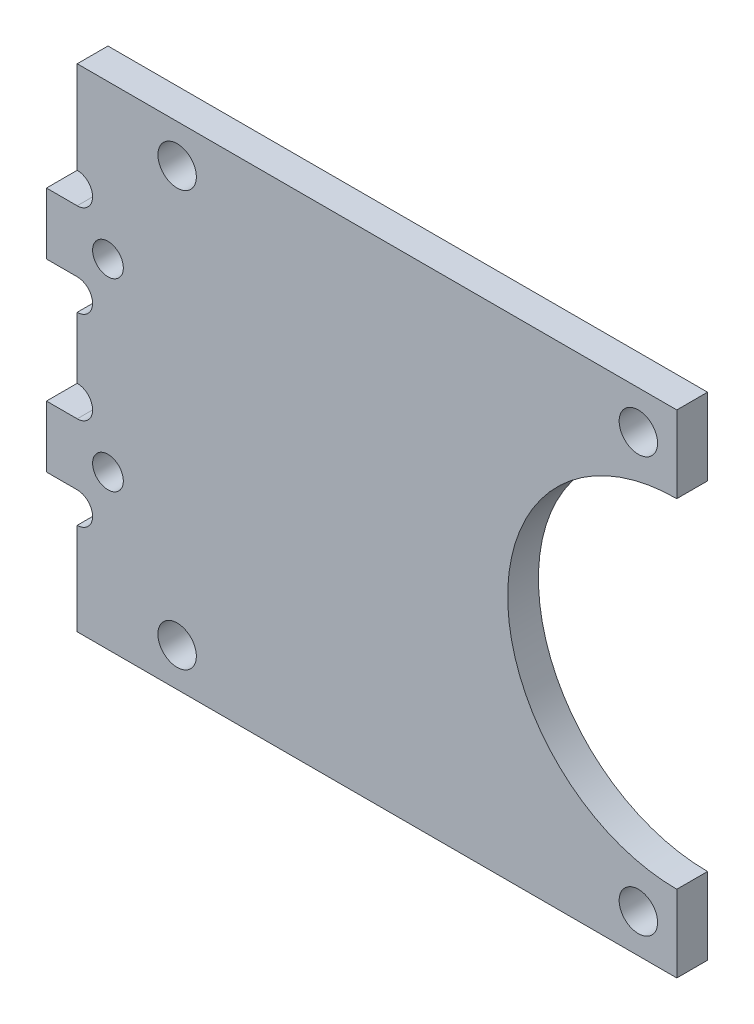
ISO-10303-21;
HEADER;
FILE_DESCRIPTION(('STEP AP214'),'2;1');
FILE_NAME('part.step','',(''),(''),'','','');
FILE_SCHEMA(('AUTOMOTIVE_DESIGN { 1 0 10303 214 1 1 1 1 }'));
ENDSEC;
DATA;
#1=APPLICATION_CONTEXT('core data for automotive mechanical design processes');
#2=APPLICATION_PROTOCOL_DEFINITION('international standard','automotive_design',2000,#1);
#3=PRODUCT_CONTEXT('',#1,'mechanical');
#4=PRODUCT('Part','Part','',(#3));
#5=PRODUCT_RELATED_PRODUCT_CATEGORY('part','',(#4));
#6=PRODUCT_DEFINITION_FORMATION('','',#4);
#7=PRODUCT_DEFINITION_CONTEXT('part definition',#1,'design');
#8=PRODUCT_DEFINITION('design','',#6,#7);
#9=PRODUCT_DEFINITION_SHAPE('','',#8);
#10=(LENGTH_UNIT() NAMED_UNIT(*) SI_UNIT(.MILLI.,.METRE.));
#11=(NAMED_UNIT(*) PLANE_ANGLE_UNIT() SI_UNIT($,.RADIAN.));
#12=(NAMED_UNIT(*) SI_UNIT($,.STERADIAN.) SOLID_ANGLE_UNIT());
#13=UNCERTAINTY_MEASURE_WITH_UNIT(LENGTH_MEASURE(1.E-05),#10,'distance_accuracy_value','');
#14=(GEOMETRIC_REPRESENTATION_CONTEXT(3) GLOBAL_UNCERTAINTY_ASSIGNED_CONTEXT((#13)) GLOBAL_UNIT_ASSIGNED_CONTEXT((#10,
#11,#12)) REPRESENTATION_CONTEXT('',''));
#15=CARTESIAN_POINT('',(0.,0.,0.));
#16=DIRECTION('',(0.,0.,1.));
#17=DIRECTION('',(1.,0.,0.));
#18=AXIS2_PLACEMENT_3D('',#15,#16,#17);
#19=CARTESIAN_POINT('',(13.2837868020581,10.1625,2.));
#20=DIRECTION('',(-1.,0.,0.));
#21=DIRECTION('',(0.,-1.,0.));
#22=AXIS2_PLACEMENT_3D('',#19,#20,#21);
#23=PLANE('',#22);
#24=DIRECTION('',(0.,1.,0.));
#25=VECTOR('',#24,1.);
#26=CARTESIAN_POINT('',(13.2837868020581,10.1625,2.));
#27=LINE('',#26,#25);
#28=CARTESIAN_POINT('',(13.2837868020581,5.1625,2.));
#29=VERTEX_POINT('',#28);
#30=CARTESIAN_POINT('',(13.2837868020581,10.1625,2.));
#31=VERTEX_POINT('',#30);
#32=EDGE_CURVE('E55',#29,#31,#27,.T.);
#33=ORIENTED_EDGE('',*,*,#32,.F.);
#34=DIRECTION('',(0.,0.,-1.));
#35=VECTOR('',#34,1.);
#36=CARTESIAN_POINT('',(13.2837868020581,5.1625,2.));
#37=LINE('',#36,#35);
#38=CARTESIAN_POINT('',(13.2837868020581,5.1625,0.));
#39=VERTEX_POINT('',#38);
#40=EDGE_CURVE('E320',#29,#39,#37,.T.);
#41=ORIENTED_EDGE('',*,*,#40,.T.);
#42=DIRECTION('',(0.,1.,0.));
#43=VECTOR('',#42,1.);
#44=CARTESIAN_POINT('',(13.2837868020581,10.1625,0.));
#45=LINE('',#44,#43);
#46=CARTESIAN_POINT('',(13.2837868020581,10.1625,0.));
#47=VERTEX_POINT('',#46);
#48=EDGE_CURVE('E114',#39,#47,#45,.T.);
#49=ORIENTED_EDGE('',*,*,#48,.T.);
#50=DIRECTION('',(0.,0.,-1.));
#51=VECTOR('',#50,1.);
#52=CARTESIAN_POINT('',(13.2837868020581,10.1625,2.));
#53=LINE('',#52,#51);
#54=EDGE_CURVE('E192',#31,#47,#53,.T.);
#55=ORIENTED_EDGE('',*,*,#54,.F.);
#56=EDGE_LOOP('',(#33,#41,#49,#55));
#57=FACE_BOUND('',#56,.T.);
#58=ADVANCED_FACE('F32',(#57),#23,.F.);
#59=CARTESIAN_POINT('',(-25.7162131979419,3.1625,2.));
#60=DIRECTION('',(0.,0.,1.));
#61=DIRECTION('',(1.,0.,0.));
#62=AXIS2_PLACEMENT_3D('',#59,#60,#61);
#63=PLANE('',#62);
#64=CARTESIAN_POINT('',(13.2837868020581,-5.8375,2.));
#65=DIRECTION('',(0.,0.,-1.));
#66=DIRECTION('',(1.,0.,0.));
#67=AXIS2_PLACEMENT_3D('',#64,#65,#66);
#68=CIRCLE('',#67,11.);
#69=CARTESIAN_POINT('',(13.2837868020581,-16.8375,2.));
#70=VERTEX_POINT('',#69);
#71=EDGE_CURVE('E47',#70,#29,#68,.T.);
#72=ORIENTED_EDGE('',*,*,#71,.T.);
#73=ORIENTED_EDGE('',*,*,#32,.T.);
#74=DIRECTION('',(-1.,0.,0.));
#75=VECTOR('',#74,1.);
#76=CARTESIAN_POINT('',(-17.2162131979419,10.1625,2.));
#77=LINE('',#76,#75);
#78=CARTESIAN_POINT('',(-25.7162131979419,10.1625,2.));
#79=VERTEX_POINT('',#78);
#80=EDGE_CURVE('E119',#31,#79,#77,.T.);
#81=ORIENTED_EDGE('',*,*,#80,.T.);
#82=DIRECTION('',(0.,-1.,0.));
#83=VECTOR('',#82,1.);
#84=CARTESIAN_POINT('',(-25.7162131979419,10.1625,2.));
#85=LINE('',#84,#83);
#86=CARTESIAN_POINT('',(-25.7162131979419,4.1625,2.));
#87=VERTEX_POINT('',#86);
#88=EDGE_CURVE('E368',#79,#87,#85,.T.);
#89=ORIENTED_EDGE('',*,*,#88,.T.);
#90=CARTESIAN_POINT('',(-25.7162131979419,3.1625,2.));
#91=DIRECTION('',(0.,0.,-1.));
#92=DIRECTION('',(1.,0.,0.));
#93=AXIS2_PLACEMENT_3D('',#90,#91,#92);
#94=CIRCLE('',#93,1.);
#95=CARTESIAN_POINT('',(-25.7162131979419,2.1625,2.));
#96=VERTEX_POINT('',#95);
#97=EDGE_CURVE('E265',#87,#96,#94,.T.);
#98=ORIENTED_EDGE('',*,*,#97,.T.);
#99=DIRECTION('',(-1.,0.,0.));
#100=VECTOR('',#99,1.);
#101=CARTESIAN_POINT('',(-25.7162131979419,2.1625,2.));
#102=LINE('',#101,#100);
#103=CARTESIAN_POINT('',(-27.7162131979419,2.1625,2.));
#104=VERTEX_POINT('',#103);
#105=EDGE_CURVE('E287',#96,#104,#102,.T.);
#106=ORIENTED_EDGE('',*,*,#105,.T.);
#107=DIRECTION('',(0.,-1.,0.));
#108=VECTOR('',#107,1.);
#109=CARTESIAN_POINT('',(-27.7162131979419,2.1625,2.));
#110=LINE('',#109,#108);
#111=CARTESIAN_POINT('',(-27.7162131979419,-1.8375,2.));
#112=VERTEX_POINT('',#111);
#113=EDGE_CURVE('E284',#104,#112,#110,.T.);
#114=ORIENTED_EDGE('',*,*,#113,.T.);
#115=DIRECTION('',(1.,0.,0.));
#116=VECTOR('',#115,1.);
#117=CARTESIAN_POINT('',(-27.7162131979419,-1.8375,2.));
#118=LINE('',#117,#116);
#119=CARTESIAN_POINT('',(-25.7162131979419,-1.8375,2.));
#120=VERTEX_POINT('',#119);
#121=EDGE_CURVE('E286',#112,#120,#118,.T.);
#122=ORIENTED_EDGE('',*,*,#121,.T.);
#123=CARTESIAN_POINT('',(-25.7162131979419,-2.8375,2.));
#124=DIRECTION('',(0.,0.,-1.));
#125=DIRECTION('',(-1.,0.,0.));
#126=AXIS2_PLACEMENT_3D('',#123,#124,#125);
#127=CIRCLE('',#126,1.);
#128=CARTESIAN_POINT('',(-25.7162131979419,-3.8375,2.));
#129=VERTEX_POINT('',#128);
#130=EDGE_CURVE('E289',#120,#129,#127,.T.);
#131=ORIENTED_EDGE('',*,*,#130,.T.);
#132=DIRECTION('',(0.,-1.,0.));
#133=VECTOR('',#132,1.);
#134=CARTESIAN_POINT('',(-25.7162131979419,-3.8375,2.));
#135=LINE('',#134,#133);
#136=CARTESIAN_POINT('',(-25.7162131979419,-7.8375,2.));
#137=VERTEX_POINT('',#136);
#138=EDGE_CURVE('E295',#129,#137,#135,.T.);
#139=ORIENTED_EDGE('',*,*,#138,.T.);
#140=CARTESIAN_POINT('',(-25.7162131979419,-8.8375,2.));
#141=DIRECTION('',(0.,0.,-1.));
#142=DIRECTION('',(1.,0.,0.));
#143=AXIS2_PLACEMENT_3D('',#140,#141,#142);
#144=CIRCLE('',#143,1.);
#145=CARTESIAN_POINT('',(-25.7162131979419,-9.8375,2.));
#146=VERTEX_POINT('',#145);
#147=EDGE_CURVE('E297',#137,#146,#144,.T.);
#148=ORIENTED_EDGE('',*,*,#147,.T.);
#149=DIRECTION('',(-1.,0.,0.));
#150=VECTOR('',#149,1.);
#151=CARTESIAN_POINT('',(-27.7162131979419,-9.8375,2.));
#152=LINE('',#151,#150);
#153=CARTESIAN_POINT('',(-27.7162131979419,-9.8375,2.));
#154=VERTEX_POINT('',#153);
#155=EDGE_CURVE('E299',#146,#154,#152,.T.);
#156=ORIENTED_EDGE('',*,*,#155,.T.);
#157=DIRECTION('',(0.,-1.,0.));
#158=VECTOR('',#157,1.);
#159=CARTESIAN_POINT('',(-27.7162131979419,-13.8375,2.));
#160=LINE('',#159,#158);
#161=CARTESIAN_POINT('',(-27.7162131979419,-13.8375,2.));
#162=VERTEX_POINT('',#161);
#163=EDGE_CURVE('E301',#154,#162,#160,.T.);
#164=ORIENTED_EDGE('',*,*,#163,.T.);
#165=DIRECTION('',(1.,0.,0.));
#166=VECTOR('',#165,1.);
#167=CARTESIAN_POINT('',(-25.7162131979419,-13.8375,2.));
#168=LINE('',#167,#166);
#169=CARTESIAN_POINT('',(-25.7162131979419,-13.8375,2.));
#170=VERTEX_POINT('',#169);
#171=EDGE_CURVE('E303',#162,#170,#168,.T.);
#172=ORIENTED_EDGE('',*,*,#171,.T.);
#173=CARTESIAN_POINT('',(-25.7162131979419,-14.8375,2.));
#174=DIRECTION('',(0.,0.,-1.));
#175=DIRECTION('',(-1.,0.,0.));
#176=AXIS2_PLACEMENT_3D('',#173,#174,#175);
#177=CIRCLE('',#176,0.999999999999999);
#178=CARTESIAN_POINT('',(-25.7162131979419,-15.8375,2.));
#179=VERTEX_POINT('',#178);
#180=EDGE_CURVE('E169',#170,#179,#177,.T.);
#181=ORIENTED_EDGE('',*,*,#180,.T.);
#182=DIRECTION('',(0.,-1.,0.));
#183=VECTOR('',#182,1.);
#184=CARTESIAN_POINT('',(-25.7162131979419,-15.8375,2.));
#185=LINE('',#184,#183);
#186=CARTESIAN_POINT('',(-25.7162131979419,-21.8375,2.));
#187=VERTEX_POINT('',#186);
#188=EDGE_CURVE('E160',#179,#187,#185,.T.);
#189=ORIENTED_EDGE('',*,*,#188,.T.);
#190=DIRECTION('',(1.,0.,0.));
#191=VECTOR('',#190,1.);
#192=CARTESIAN_POINT('',(-19.7162131979419,-21.8375,2.));
#193=LINE('',#192,#191);
#194=CARTESIAN_POINT('',(13.2837868020581,-21.8375,2.));
#195=VERTEX_POINT('',#194);
#196=EDGE_CURVE('E166',#187,#195,#193,.T.);
#197=ORIENTED_EDGE('',*,*,#196,.T.);
#198=EDGE_CURVE('E188',#195,#70,#27,.T.);
#199=ORIENTED_EDGE('',*,*,#198,.T.);
#200=EDGE_LOOP('',(#72,#73,#81,#89,#98,#106,#114,#122,#131,#139,#148,#156,#164,#172,#181,#189,
#197,#199));
#201=FACE_BOUND('',#200,.T.);
#202=CARTESIAN_POINT('',(-23.7162131979419,0.162500000000001,2.));
#203=DIRECTION('',(0.,0.,1.));
#204=DIRECTION('',(1.,0.,0.));
#205=AXIS2_PLACEMENT_3D('',#202,#203,#204);
#206=CIRCLE('',#205,1.);
#207=CARTESIAN_POINT('',(-22.7162131979419,0.162500000000001,2.));
#208=VERTEX_POINT('',#207);
#209=EDGE_CURVE('E339',#208,#208,#206,.T.);
#210=ORIENTED_EDGE('',*,*,#209,.F.);
#211=EDGE_LOOP('',(#210));
#212=FACE_BOUND('',#211,.T.);
#213=CARTESIAN_POINT('',(10.7837868020581,7.6625,2.));
#214=DIRECTION('',(0.,0.,1.));
#215=DIRECTION('',(1.,0.,0.));
#216=AXIS2_PLACEMENT_3D('',#213,#214,#215);
#217=CIRCLE('',#216,1.25);
#218=CARTESIAN_POINT('',(12.0337868020581,7.6625,2.));
#219=VERTEX_POINT('',#218);
#220=EDGE_CURVE('E351',#219,#219,#217,.T.);
#221=ORIENTED_EDGE('',*,*,#220,.F.);
#222=EDGE_LOOP('',(#221));
#223=FACE_BOUND('',#222,.T.);
#224=CARTESIAN_POINT('',(-19.2162131979419,7.6625,2.));
#225=DIRECTION('',(0.,0.,1.));
#226=DIRECTION('',(1.,0.,0.));
#227=AXIS2_PLACEMENT_3D('',#224,#225,#226);
#228=CIRCLE('',#227,1.25);
#229=CARTESIAN_POINT('',(-17.9662131979419,7.6625,2.));
#230=VERTEX_POINT('',#229);
#231=EDGE_CURVE('E196',#230,#230,#228,.T.);
#232=ORIENTED_EDGE('',*,*,#231,.F.);
#233=EDGE_LOOP('',(#232));
#234=FACE_BOUND('',#233,.T.);
#235=CARTESIAN_POINT('',(10.7837868020581,-19.3375,2.));
#236=DIRECTION('',(0.,0.,1.));
#237=DIRECTION('',(1.,0.,0.));
#238=AXIS2_PLACEMENT_3D('',#235,#236,#237);
#239=CIRCLE('',#238,1.25);
#240=CARTESIAN_POINT('',(12.0337868020581,-19.3375,2.));
#241=VERTEX_POINT('',#240);
#242=EDGE_CURVE('E357',#241,#241,#239,.T.);
#243=ORIENTED_EDGE('',*,*,#242,.F.);
#244=EDGE_LOOP('',(#243));
#245=FACE_BOUND('',#244,.T.);
#246=CARTESIAN_POINT('',(-19.2162131979419,-19.3375,2.));
#247=DIRECTION('',(0.,0.,1.));
#248=DIRECTION('',(1.,0.,0.));
#249=AXIS2_PLACEMENT_3D('',#246,#247,#248);
#250=CIRCLE('',#249,1.25);
#251=CARTESIAN_POINT('',(-17.9662131979419,-19.3375,2.));
#252=VERTEX_POINT('',#251);
#253=EDGE_CURVE('E345',#252,#252,#250,.T.);
#254=ORIENTED_EDGE('',*,*,#253,.F.);
#255=EDGE_LOOP('',(#254));
#256=FACE_BOUND('',#255,.T.);
#257=CARTESIAN_POINT('',(-23.7162131979419,-11.8375,2.));
#258=DIRECTION('',(0.,0.,1.));
#259=DIRECTION('',(1.,0.,0.));
#260=AXIS2_PLACEMENT_3D('',#257,#258,#259);
#261=CIRCLE('',#260,1.);
#262=CARTESIAN_POINT('',(-22.7162131979419,-11.8375,2.));
#263=VERTEX_POINT('',#262);
#264=EDGE_CURVE('E331',#263,#263,#261,.T.);
#265=ORIENTED_EDGE('',*,*,#264,.F.);
#266=EDGE_LOOP('',(#265));
#267=FACE_BOUND('',#266,.T.);
#268=ADVANCED_FACE('F162',(#201,#212,#223,#234,#245,#256,#267),#63,.T.);
#269=CARTESIAN_POINT('',(-25.7162131979419,3.1625,0.));
#270=DIRECTION('',(0.,0.,1.));
#271=DIRECTION('',(1.,0.,0.));
#272=AXIS2_PLACEMENT_3D('',#269,#270,#271);
#273=PLANE('',#272);
#274=ORIENTED_EDGE('',*,*,#48,.F.);
#275=CARTESIAN_POINT('',(13.2837868020581,-5.8375,0.));
#276=DIRECTION('',(0.,0.,-1.));
#277=DIRECTION('',(1.,0.,0.));
#278=AXIS2_PLACEMENT_3D('',#275,#276,#277);
#279=CIRCLE('',#278,11.);
#280=CARTESIAN_POINT('',(13.2837868020581,-16.8375,0.));
#281=VERTEX_POINT('',#280);
#282=EDGE_CURVE('E321',#281,#39,#279,.T.);
#283=ORIENTED_EDGE('',*,*,#282,.F.);
#284=CARTESIAN_POINT('',(13.2837868020581,-21.8375,0.));
#285=VERTEX_POINT('',#284);
#286=EDGE_CURVE('E221',#285,#281,#45,.T.);
#287=ORIENTED_EDGE('',*,*,#286,.F.);
#288=DIRECTION('',(1.,0.,0.));
#289=VECTOR('',#288,1.);
#290=CARTESIAN_POINT('',(13.2837868020581,-21.8375,0.));
#291=LINE('',#290,#289);
#292=CARTESIAN_POINT('',(-25.7162131979419,-21.8375,0.));
#293=VERTEX_POINT('',#292);
#294=EDGE_CURVE('E219',#293,#285,#291,.T.);
#295=ORIENTED_EDGE('',*,*,#294,.F.);
#296=DIRECTION('',(0.,-1.,0.));
#297=VECTOR('',#296,1.);
#298=CARTESIAN_POINT('',(-25.7162131979419,-15.8375,0.));
#299=LINE('',#298,#297);
#300=CARTESIAN_POINT('',(-25.7162131979419,-15.8375,0.));
#301=VERTEX_POINT('',#300);
#302=EDGE_CURVE('E179',#301,#293,#299,.T.);
#303=ORIENTED_EDGE('',*,*,#302,.F.);
#304=CARTESIAN_POINT('',(-25.7162131979419,-14.8375,0.));
#305=DIRECTION('',(0.,0.,-1.));
#306=DIRECTION('',(-1.,0.,0.));
#307=AXIS2_PLACEMENT_3D('',#304,#305,#306);
#308=CIRCLE('',#307,0.999999999999999);
#309=CARTESIAN_POINT('',(-25.7162131979419,-13.8375,0.));
#310=VERTEX_POINT('',#309);
#311=EDGE_CURVE('E216',#310,#301,#308,.T.);
#312=ORIENTED_EDGE('',*,*,#311,.F.);
#313=DIRECTION('',(1.,0.,0.));
#314=VECTOR('',#313,1.);
#315=CARTESIAN_POINT('',(-25.7162131979419,-13.8375,0.));
#316=LINE('',#315,#314);
#317=CARTESIAN_POINT('',(-27.7162131979419,-13.8375,0.));
#318=VERTEX_POINT('',#317);
#319=EDGE_CURVE('E214',#318,#310,#316,.T.);
#320=ORIENTED_EDGE('',*,*,#319,.F.);
#321=DIRECTION('',(0.,-1.,0.));
#322=VECTOR('',#321,1.);
#323=CARTESIAN_POINT('',(-27.7162131979419,-13.8375,0.));
#324=LINE('',#323,#322);
#325=CARTESIAN_POINT('',(-27.7162131979419,-9.8375,0.));
#326=VERTEX_POINT('',#325);
#327=EDGE_CURVE('E212',#326,#318,#324,.T.);
#328=ORIENTED_EDGE('',*,*,#327,.F.);
#329=DIRECTION('',(-1.,0.,0.));
#330=VECTOR('',#329,1.);
#331=CARTESIAN_POINT('',(-27.7162131979419,-9.8375,0.));
#332=LINE('',#331,#330);
#333=CARTESIAN_POINT('',(-25.7162131979419,-9.8375,0.));
#334=VERTEX_POINT('',#333);
#335=EDGE_CURVE('E210',#334,#326,#332,.T.);
#336=ORIENTED_EDGE('',*,*,#335,.F.);
#337=CARTESIAN_POINT('',(-25.7162131979419,-8.8375,0.));
#338=DIRECTION('',(0.,0.,-1.));
#339=DIRECTION('',(1.,0.,0.));
#340=AXIS2_PLACEMENT_3D('',#337,#338,#339);
#341=CIRCLE('',#340,1.);
#342=CARTESIAN_POINT('',(-25.7162131979419,-7.8375,0.));
#343=VERTEX_POINT('',#342);
#344=EDGE_CURVE('E208',#343,#334,#341,.T.);
#345=ORIENTED_EDGE('',*,*,#344,.F.);
#346=DIRECTION('',(0.,-1.,0.));
#347=VECTOR('',#346,1.);
#348=CARTESIAN_POINT('',(-25.7162131979419,-3.8375,0.));
#349=LINE('',#348,#347);
#350=CARTESIAN_POINT('',(-25.7162131979419,-3.8375,0.));
#351=VERTEX_POINT('',#350);
#352=EDGE_CURVE('E206',#351,#343,#349,.T.);
#353=ORIENTED_EDGE('',*,*,#352,.F.);
#354=CARTESIAN_POINT('',(-25.7162131979419,-2.8375,0.));
#355=DIRECTION('',(0.,0.,-1.));
#356=DIRECTION('',(-1.,0.,0.));
#357=AXIS2_PLACEMENT_3D('',#354,#355,#356);
#358=CIRCLE('',#357,1.);
#359=CARTESIAN_POINT('',(-25.7162131979419,-1.8375,0.));
#360=VERTEX_POINT('',#359);
#361=EDGE_CURVE('E204',#360,#351,#358,.T.);
#362=ORIENTED_EDGE('',*,*,#361,.F.);
#363=DIRECTION('',(1.,0.,0.));
#364=VECTOR('',#363,1.);
#365=CARTESIAN_POINT('',(-27.7162131979419,-1.8375,0.));
#366=LINE('',#365,#364);
#367=CARTESIAN_POINT('',(-27.7162131979419,-1.8375,0.));
#368=VERTEX_POINT('',#367);
#369=EDGE_CURVE('E202',#368,#360,#366,.T.);
#370=ORIENTED_EDGE('',*,*,#369,.F.);
#371=DIRECTION('',(0.,-1.,0.));
#372=VECTOR('',#371,1.);
#373=CARTESIAN_POINT('',(-27.7162131979419,2.1625,0.));
#374=LINE('',#373,#372);
#375=CARTESIAN_POINT('',(-27.7162131979419,2.1625,0.));
#376=VERTEX_POINT('',#375);
#377=EDGE_CURVE('E200',#376,#368,#374,.T.);
#378=ORIENTED_EDGE('',*,*,#377,.F.);
#379=DIRECTION('',(-1.,0.,0.));
#380=VECTOR('',#379,1.);
#381=CARTESIAN_POINT('',(-25.7162131979419,2.1625,0.));
#382=LINE('',#381,#380);
#383=CARTESIAN_POINT('',(-25.7162131979419,2.1625,0.));
#384=VERTEX_POINT('',#383);
#385=EDGE_CURVE('E198',#384,#376,#382,.T.);
#386=ORIENTED_EDGE('',*,*,#385,.F.);
#387=CARTESIAN_POINT('',(-25.7162131979419,3.1625,0.));
#388=DIRECTION('',(0.,0.,-1.));
#389=DIRECTION('',(1.,0.,0.));
#390=AXIS2_PLACEMENT_3D('',#387,#388,#389);
#391=CIRCLE('',#390,1.);
#392=CARTESIAN_POINT('',(-25.7162131979419,4.1625,0.));
#393=VERTEX_POINT('',#392);
#394=EDGE_CURVE('E195',#393,#384,#391,.T.);
#395=ORIENTED_EDGE('',*,*,#394,.F.);
#396=DIRECTION('',(0.,-1.,0.));
#397=VECTOR('',#396,1.);
#398=CARTESIAN_POINT('',(-25.7162131979419,10.1625,0.));
#399=LINE('',#398,#397);
#400=CARTESIAN_POINT('',(-25.7162131979419,10.1625,0.));
#401=VERTEX_POINT('',#400);
#402=EDGE_CURVE('E193',#401,#393,#399,.T.);
#403=ORIENTED_EDGE('',*,*,#402,.F.);
#404=DIRECTION('',(-1.,0.,0.));
#405=VECTOR('',#404,1.);
#406=CARTESIAN_POINT('',(-17.2162131979419,10.1625,0.));
#407=LINE('',#406,#405);
#408=EDGE_CURVE('E224',#47,#401,#407,.T.);
#409=ORIENTED_EDGE('',*,*,#408,.F.);
#410=EDGE_LOOP('',(#274,#283,#287,#295,#303,#312,#320,#328,#336,#345,#353,#362,#370,#378,#386,
#395,#403,#409));
#411=FACE_BOUND('',#410,.T.);
#412=CARTESIAN_POINT('',(-19.2162131979419,7.6625,0.));
#413=DIRECTION('',(0.,0.,1.));
#414=DIRECTION('',(1.,0.,0.));
#415=AXIS2_PLACEMENT_3D('',#412,#413,#414);
#416=CIRCLE('',#415,1.25);
#417=CARTESIAN_POINT('',(-17.9662131979419,7.6625,0.));
#418=VERTEX_POINT('',#417);
#419=EDGE_CURVE('E360',#418,#418,#416,.T.);
#420=ORIENTED_EDGE('',*,*,#419,.T.);
#421=EDGE_LOOP('',(#420));
#422=FACE_BOUND('',#421,.T.);
#423=CARTESIAN_POINT('',(10.7837868020581,-19.3375,0.));
#424=DIRECTION('',(0.,0.,1.));
#425=DIRECTION('',(1.,0.,0.));
#426=AXIS2_PLACEMENT_3D('',#423,#424,#425);
#427=CIRCLE('',#426,1.25);
#428=CARTESIAN_POINT('',(12.0337868020581,-19.3375,0.));
#429=VERTEX_POINT('',#428);
#430=EDGE_CURVE('E354',#429,#429,#427,.T.);
#431=ORIENTED_EDGE('',*,*,#430,.T.);
#432=EDGE_LOOP('',(#431));
#433=FACE_BOUND('',#432,.T.);
#434=CARTESIAN_POINT('',(10.7837868020581,7.6625,0.));
#435=DIRECTION('',(0.,0.,1.));
#436=DIRECTION('',(1.,0.,0.));
#437=AXIS2_PLACEMENT_3D('',#434,#435,#436);
#438=CIRCLE('',#437,1.25);
#439=CARTESIAN_POINT('',(12.0337868020581,7.6625,0.));
#440=VERTEX_POINT('',#439);
#441=EDGE_CURVE('E348',#440,#440,#438,.T.);
#442=ORIENTED_EDGE('',*,*,#441,.T.);
#443=EDGE_LOOP('',(#442));
#444=FACE_BOUND('',#443,.T.);
#445=CARTESIAN_POINT('',(-19.2162131979419,-19.3375,0.));
#446=DIRECTION('',(0.,0.,1.));
#447=DIRECTION('',(1.,0.,0.));
#448=AXIS2_PLACEMENT_3D('',#445,#446,#447);
#449=CIRCLE('',#448,1.25);
#450=CARTESIAN_POINT('',(-17.9662131979419,-19.3375,0.));
#451=VERTEX_POINT('',#450);
#452=EDGE_CURVE('E342',#451,#451,#449,.T.);
#453=ORIENTED_EDGE('',*,*,#452,.T.);
#454=EDGE_LOOP('',(#453));
#455=FACE_BOUND('',#454,.T.);
#456=CARTESIAN_POINT('',(-23.7162131979419,0.162500000000001,0.));
#457=DIRECTION('',(0.,0.,1.));
#458=DIRECTION('',(1.,0.,0.));
#459=AXIS2_PLACEMENT_3D('',#456,#457,#458);
#460=CIRCLE('',#459,1.);
#461=CARTESIAN_POINT('',(-22.7162131979419,0.162500000000001,0.));
#462=VERTEX_POINT('',#461);
#463=EDGE_CURVE('E337',#462,#462,#460,.T.);
#464=ORIENTED_EDGE('',*,*,#463,.T.);
#465=EDGE_LOOP('',(#464));
#466=FACE_BOUND('',#465,.T.);
#467=CARTESIAN_POINT('',(-23.7162131979419,-11.8375,0.));
#468=DIRECTION('',(0.,0.,1.));
#469=DIRECTION('',(1.,0.,0.));
#470=AXIS2_PLACEMENT_3D('',#467,#468,#469);
#471=CIRCLE('',#470,1.);
#472=CARTESIAN_POINT('',(-22.7162131979419,-11.8375,0.));
#473=VERTEX_POINT('',#472);
#474=EDGE_CURVE('E328',#473,#473,#471,.T.);
#475=ORIENTED_EDGE('',*,*,#474,.T.);
#476=EDGE_LOOP('',(#475));
#477=FACE_BOUND('',#476,.T.);
#478=ADVANCED_FACE('F271',(#411,#422,#433,#444,#455,#466,#477),#273,.F.);
#479=CARTESIAN_POINT('',(-25.7162131979419,10.1625,2.));
#480=DIRECTION('',(1.,0.,0.));
#481=DIRECTION('',(0.,0.,-1.));
#482=AXIS2_PLACEMENT_3D('',#479,#480,#481);
#483=PLANE('',#482);
#484=ORIENTED_EDGE('',*,*,#402,.T.);
#485=DIRECTION('',(0.,0.,-1.));
#486=VECTOR('',#485,1.);
#487=CARTESIAN_POINT('',(-25.7162131979419,4.1625,2.));
#488=LINE('',#487,#486);
#489=EDGE_CURVE('E40',#87,#393,#488,.T.);
#490=ORIENTED_EDGE('',*,*,#489,.F.);
#491=ORIENTED_EDGE('',*,*,#88,.F.);
#492=DIRECTION('',(0.,0.,-1.));
#493=VECTOR('',#492,1.);
#494=CARTESIAN_POINT('',(-25.7162131979419,10.1625,2.));
#495=LINE('',#494,#493);
#496=EDGE_CURVE('E11',#79,#401,#495,.T.);
#497=ORIENTED_EDGE('',*,*,#496,.T.);
#498=EDGE_LOOP('',(#484,#490,#491,#497));
#499=FACE_BOUND('',#498,.T.);
#500=ADVANCED_FACE('F34',(#499),#483,.F.);
#501=CARTESIAN_POINT('',(-25.7162131979419,3.1625,2.));
#502=DIRECTION('',(0.,0.,-1.));
#503=DIRECTION('',(-1.,0.,0.));
#504=AXIS2_PLACEMENT_3D('',#501,#502,#503);
#505=CYLINDRICAL_SURFACE('',#504,1.);
#506=ORIENTED_EDGE('',*,*,#394,.T.);
#507=DIRECTION('',(0.,0.,-1.));
#508=VECTOR('',#507,1.);
#509=CARTESIAN_POINT('',(-25.7162131979419,2.1625,2.));
#510=LINE('',#509,#508);
#511=EDGE_CURVE('E256',#96,#384,#510,.T.);
#512=ORIENTED_EDGE('',*,*,#511,.F.);
#513=ORIENTED_EDGE('',*,*,#97,.F.);
#514=ORIENTED_EDGE('',*,*,#489,.T.);
#515=EDGE_LOOP('',(#506,#512,#513,#514));
#516=FACE_BOUND('',#515,.T.);
#517=ADVANCED_FACE('F263',(#516),#505,.F.);
#518=CARTESIAN_POINT('',(-25.7162131979419,2.1625,2.));
#519=DIRECTION('',(0.,-1.,0.));
#520=DIRECTION('',(1.,0.,0.));
#521=AXIS2_PLACEMENT_3D('',#518,#519,#520);
#522=PLANE('',#521);
#523=ORIENTED_EDGE('',*,*,#385,.T.);
#524=DIRECTION('',(0.,0.,-1.));
#525=VECTOR('',#524,1.);
#526=CARTESIAN_POINT('',(-27.7162131979419,2.1625,2.));
#527=LINE('',#526,#525);
#528=EDGE_CURVE('E253',#104,#376,#527,.T.);
#529=ORIENTED_EDGE('',*,*,#528,.F.);
#530=ORIENTED_EDGE('',*,*,#105,.F.);
#531=ORIENTED_EDGE('',*,*,#511,.T.);
#532=EDGE_LOOP('',(#523,#529,#530,#531));
#533=FACE_BOUND('',#532,.T.);
#534=ADVANCED_FACE('F278',(#533),#522,.F.);
#535=CARTESIAN_POINT('',(-27.7162131979419,2.1625,2.));
#536=DIRECTION('',(1.,0.,0.));
#537=DIRECTION('',(0.,0.,-1.));
#538=AXIS2_PLACEMENT_3D('',#535,#536,#537);
#539=PLANE('',#538);
#540=ORIENTED_EDGE('',*,*,#377,.T.);
#541=DIRECTION('',(0.,0.,-1.));
#542=VECTOR('',#541,1.);
#543=CARTESIAN_POINT('',(-27.7162131979419,-1.8375,2.));
#544=LINE('',#543,#542);
#545=EDGE_CURVE('E250',#112,#368,#544,.T.);
#546=ORIENTED_EDGE('',*,*,#545,.F.);
#547=ORIENTED_EDGE('',*,*,#113,.F.);
#548=ORIENTED_EDGE('',*,*,#528,.T.);
#549=EDGE_LOOP('',(#540,#546,#547,#548));
#550=FACE_BOUND('',#549,.T.);
#551=ADVANCED_FACE('F282',(#550),#539,.F.);
#552=CARTESIAN_POINT('',(-27.7162131979419,-1.8375,2.));
#553=DIRECTION('',(0.,1.,0.));
#554=DIRECTION('',(-1.,0.,0.));
#555=AXIS2_PLACEMENT_3D('',#552,#553,#554);
#556=PLANE('',#555);
#557=ORIENTED_EDGE('',*,*,#369,.T.);
#558=DIRECTION('',(0.,0.,-1.));
#559=VECTOR('',#558,1.);
#560=CARTESIAN_POINT('',(-25.7162131979419,-1.8375,2.));
#561=LINE('',#560,#559);
#562=EDGE_CURVE('E247',#120,#360,#561,.T.);
#563=ORIENTED_EDGE('',*,*,#562,.F.);
#564=ORIENTED_EDGE('',*,*,#121,.F.);
#565=ORIENTED_EDGE('',*,*,#545,.T.);
#566=EDGE_LOOP('',(#557,#563,#564,#565));
#567=FACE_BOUND('',#566,.T.);
#568=ADVANCED_FACE('F417',(#567),#556,.F.);
#569=CARTESIAN_POINT('',(-25.7162131979419,-2.8375,2.));
#570=DIRECTION('',(0.,0.,-1.));
#571=DIRECTION('',(-1.,0.,0.));
#572=AXIS2_PLACEMENT_3D('',#569,#570,#571);
#573=CYLINDRICAL_SURFACE('',#572,1.);
#574=ORIENTED_EDGE('',*,*,#361,.T.);
#575=DIRECTION('',(0.,0.,-1.));
#576=VECTOR('',#575,1.);
#577=CARTESIAN_POINT('',(-25.7162131979419,-3.8375,2.));
#578=LINE('',#577,#576);
#579=EDGE_CURVE('E244',#129,#351,#578,.T.);
#580=ORIENTED_EDGE('',*,*,#579,.F.);
#581=ORIENTED_EDGE('',*,*,#130,.F.);
#582=ORIENTED_EDGE('',*,*,#562,.T.);
#583=EDGE_LOOP('',(#574,#580,#581,#582));
#584=FACE_BOUND('',#583,.T.);
#585=ADVANCED_FACE('F413',(#584),#573,.F.);
#586=CARTESIAN_POINT('',(-25.7162131979419,-3.8375,2.));
#587=DIRECTION('',(1.,0.,0.));
#588=DIRECTION('',(0.,0.,-1.));
#589=AXIS2_PLACEMENT_3D('',#586,#587,#588);
#590=PLANE('',#589);
#591=ORIENTED_EDGE('',*,*,#352,.T.);
#592=DIRECTION('',(0.,0.,-1.));
#593=VECTOR('',#592,1.);
#594=CARTESIAN_POINT('',(-25.7162131979419,-7.8375,2.));
#595=LINE('',#594,#593);
#596=EDGE_CURVE('E241',#137,#343,#595,.T.);
#597=ORIENTED_EDGE('',*,*,#596,.F.);
#598=ORIENTED_EDGE('',*,*,#138,.F.);
#599=ORIENTED_EDGE('',*,*,#579,.T.);
#600=EDGE_LOOP('',(#591,#597,#598,#599));
#601=FACE_BOUND('',#600,.T.);
#602=ADVANCED_FACE('F409',(#601),#590,.F.);
#603=CARTESIAN_POINT('',(-25.7162131979419,-8.8375,2.));
#604=DIRECTION('',(0.,0.,-1.));
#605=DIRECTION('',(-1.,0.,0.));
#606=AXIS2_PLACEMENT_3D('',#603,#604,#605);
#607=CYLINDRICAL_SURFACE('',#606,1.);
#608=ORIENTED_EDGE('',*,*,#344,.T.);
#609=DIRECTION('',(0.,0.,-1.));
#610=VECTOR('',#609,1.);
#611=CARTESIAN_POINT('',(-25.7162131979419,-9.8375,2.));
#612=LINE('',#611,#610);
#613=EDGE_CURVE('E238',#146,#334,#612,.T.);
#614=ORIENTED_EDGE('',*,*,#613,.F.);
#615=ORIENTED_EDGE('',*,*,#147,.F.);
#616=ORIENTED_EDGE('',*,*,#596,.T.);
#617=EDGE_LOOP('',(#608,#614,#615,#616));
#618=FACE_BOUND('',#617,.T.);
#619=ADVANCED_FACE('F405',(#618),#607,.F.);
#620=CARTESIAN_POINT('',(-27.7162131979419,-9.8375,2.));
#621=DIRECTION('',(0.,-1.,0.));
#622=DIRECTION('',(0.,0.,-1.));
#623=AXIS2_PLACEMENT_3D('',#620,#621,#622);
#624=PLANE('',#623);
#625=ORIENTED_EDGE('',*,*,#335,.T.);
#626=DIRECTION('',(0.,0.,-1.));
#627=VECTOR('',#626,1.);
#628=CARTESIAN_POINT('',(-27.7162131979419,-9.8375,2.));
#629=LINE('',#628,#627);
#630=EDGE_CURVE('E235',#154,#326,#629,.T.);
#631=ORIENTED_EDGE('',*,*,#630,.F.);
#632=ORIENTED_EDGE('',*,*,#155,.F.);
#633=ORIENTED_EDGE('',*,*,#613,.T.);
#634=EDGE_LOOP('',(#625,#631,#632,#633));
#635=FACE_BOUND('',#634,.T.);
#636=ADVANCED_FACE('F401',(#635),#624,.F.);
#637=CARTESIAN_POINT('',(-27.7162131979419,-13.8375,2.));
#638=DIRECTION('',(1.,0.,0.));
#639=DIRECTION('',(0.,0.,-1.));
#640=AXIS2_PLACEMENT_3D('',#637,#638,#639);
#641=PLANE('',#640);
#642=ORIENTED_EDGE('',*,*,#327,.T.);
#643=DIRECTION('',(0.,0.,-1.));
#644=VECTOR('',#643,1.);
#645=CARTESIAN_POINT('',(-27.7162131979419,-13.8375,2.));
#646=LINE('',#645,#644);
#647=EDGE_CURVE('E232',#162,#318,#646,.T.);
#648=ORIENTED_EDGE('',*,*,#647,.F.);
#649=ORIENTED_EDGE('',*,*,#163,.F.);
#650=ORIENTED_EDGE('',*,*,#630,.T.);
#651=EDGE_LOOP('',(#642,#648,#649,#650));
#652=FACE_BOUND('',#651,.T.);
#653=ADVANCED_FACE('F398',(#652),#641,.F.);
#654=CARTESIAN_POINT('',(-25.7162131979419,-13.8375,2.));
#655=DIRECTION('',(0.,1.,0.));
#656=DIRECTION('',(-1.,0.,0.));
#657=AXIS2_PLACEMENT_3D('',#654,#655,#656);
#658=PLANE('',#657);
#659=ORIENTED_EDGE('',*,*,#319,.T.);
#660=DIRECTION('',(0.,0.,-1.));
#661=VECTOR('',#660,1.);
#662=CARTESIAN_POINT('',(-25.7162131979419,-13.8375,2.));
#663=LINE('',#662,#661);
#664=EDGE_CURVE('E229',#170,#310,#663,.T.);
#665=ORIENTED_EDGE('',*,*,#664,.F.);
#666=ORIENTED_EDGE('',*,*,#171,.F.);
#667=ORIENTED_EDGE('',*,*,#647,.T.);
#668=EDGE_LOOP('',(#659,#665,#666,#667));
#669=FACE_BOUND('',#668,.T.);
#670=ADVANCED_FACE('F309',(#669),#658,.F.);
#671=CARTESIAN_POINT('',(-25.7162131979419,-14.8375,2.));
#672=DIRECTION('',(0.,0.,-1.));
#673=DIRECTION('',(-1.,0.,0.));
#674=AXIS2_PLACEMENT_3D('',#671,#672,#673);
#675=CYLINDRICAL_SURFACE('',#674,0.999999999999999);
#676=ORIENTED_EDGE('',*,*,#311,.T.);
#677=DIRECTION('',(0.,0.,-1.));
#678=VECTOR('',#677,1.);
#679=CARTESIAN_POINT('',(-25.7162131979419,-15.8375,2.));
#680=LINE('',#679,#678);
#681=EDGE_CURVE('E181',#179,#301,#680,.T.);
#682=ORIENTED_EDGE('',*,*,#681,.F.);
#683=ORIENTED_EDGE('',*,*,#180,.F.);
#684=ORIENTED_EDGE('',*,*,#664,.T.);
#685=EDGE_LOOP('',(#676,#682,#683,#684));
#686=FACE_BOUND('',#685,.T.);
#687=ADVANCED_FACE('F313',(#686),#675,.F.);
#688=CARTESIAN_POINT('',(-25.7162131979419,-15.8375,2.));
#689=DIRECTION('',(1.,0.,0.));
#690=DIRECTION('',(0.,1.,0.));
#691=AXIS2_PLACEMENT_3D('',#688,#689,#690);
#692=PLANE('',#691);
#693=ORIENTED_EDGE('',*,*,#302,.T.);
#694=DIRECTION('',(0.,0.,-1.));
#695=VECTOR('',#694,1.);
#696=CARTESIAN_POINT('',(-25.7162131979419,-21.8375,2.));
#697=LINE('',#696,#695);
#698=EDGE_CURVE('E176',#187,#293,#697,.T.);
#699=ORIENTED_EDGE('',*,*,#698,.F.);
#700=ORIENTED_EDGE('',*,*,#188,.F.);
#701=ORIENTED_EDGE('',*,*,#681,.T.);
#702=EDGE_LOOP('',(#693,#699,#700,#701));
#703=FACE_BOUND('',#702,.T.);
#704=ADVANCED_FACE('F177',(#703),#692,.F.);
#705=CARTESIAN_POINT('',(13.2837868020581,-21.8375,2.));
#706=DIRECTION('',(0.,1.,0.));
#707=DIRECTION('',(-1.,0.,0.));
#708=AXIS2_PLACEMENT_3D('',#705,#706,#707);
#709=PLANE('',#708);
#710=ORIENTED_EDGE('',*,*,#294,.T.);
#711=DIRECTION('',(0.,0.,-1.));
#712=VECTOR('',#711,1.);
#713=CARTESIAN_POINT('',(13.2837868020581,-21.8375,2.));
#714=LINE('',#713,#712);
#715=EDGE_CURVE('E182',#195,#285,#714,.T.);
#716=ORIENTED_EDGE('',*,*,#715,.F.);
#717=ORIENTED_EDGE('',*,*,#196,.F.);
#718=ORIENTED_EDGE('',*,*,#698,.T.);
#719=EDGE_LOOP('',(#710,#716,#717,#718));
#720=FACE_BOUND('',#719,.T.);
#721=ADVANCED_FACE('F184',(#720),#709,.F.);
#722=ORIENTED_EDGE('',*,*,#286,.T.);
#723=DIRECTION('',(0.,0.,-1.));
#724=VECTOR('',#723,1.);
#725=CARTESIAN_POINT('',(13.2837868020581,-16.8375,2.));
#726=LINE('',#725,#724);
#727=EDGE_CURVE('E318',#70,#281,#726,.T.);
#728=ORIENTED_EDGE('',*,*,#727,.F.);
#729=ORIENTED_EDGE('',*,*,#198,.F.);
#730=ORIENTED_EDGE('',*,*,#715,.T.);
#731=EDGE_LOOP('',(#722,#728,#729,#730));
#732=FACE_BOUND('',#731,.T.);
#733=ADVANCED_FACE('F317',(#732),#23,.F.);
#734=CARTESIAN_POINT('',(-17.2162131979419,10.1625,2.));
#735=DIRECTION('',(0.,-1.,0.));
#736=DIRECTION('',(0.,0.,-1.));
#737=AXIS2_PLACEMENT_3D('',#734,#735,#736);
#738=PLANE('',#737);
#739=ORIENTED_EDGE('',*,*,#408,.T.);
#740=ORIENTED_EDGE('',*,*,#496,.F.);
#741=ORIENTED_EDGE('',*,*,#80,.F.);
#742=ORIENTED_EDGE('',*,*,#54,.T.);
#743=EDGE_LOOP('',(#739,#740,#741,#742));
#744=FACE_BOUND('',#743,.T.);
#745=ADVANCED_FACE('F325',(#744),#738,.F.);
#746=CARTESIAN_POINT('',(-19.2162131979419,7.6625,2.));
#747=DIRECTION('',(0.,0.,-1.));
#748=DIRECTION('',(-1.,0.,0.));
#749=AXIS2_PLACEMENT_3D('',#746,#747,#748);
#750=CYLINDRICAL_SURFACE('',#749,1.25);
#751=ORIENTED_EDGE('',*,*,#231,.T.);
#752=EDGE_LOOP('',(#751));
#753=FACE_BOUND('',#752,.T.);
#754=ORIENTED_EDGE('',*,*,#419,.F.);
#755=EDGE_LOOP('',(#754));
#756=FACE_BOUND('',#755,.T.);
#757=ADVANCED_FACE('F388',(#753,#756),#750,.F.);
#758=CARTESIAN_POINT('',(10.7837868020581,-19.3375,2.));
#759=DIRECTION('',(0.,0.,-1.));
#760=DIRECTION('',(-1.,0.,0.));
#761=AXIS2_PLACEMENT_3D('',#758,#759,#760);
#762=CYLINDRICAL_SURFACE('',#761,1.25);
#763=ORIENTED_EDGE('',*,*,#242,.T.);
#764=EDGE_LOOP('',(#763));
#765=FACE_BOUND('',#764,.T.);
#766=ORIENTED_EDGE('',*,*,#430,.F.);
#767=EDGE_LOOP('',(#766));
#768=FACE_BOUND('',#767,.T.);
#769=ADVANCED_FACE('F492',(#765,#768),#762,.F.);
#770=CARTESIAN_POINT('',(10.7837868020581,7.6625,2.));
#771=DIRECTION('',(0.,0.,-1.));
#772=DIRECTION('',(-1.,0.,0.));
#773=AXIS2_PLACEMENT_3D('',#770,#771,#772);
#774=CYLINDRICAL_SURFACE('',#773,1.25);
#775=ORIENTED_EDGE('',*,*,#220,.T.);
#776=EDGE_LOOP('',(#775));
#777=FACE_BOUND('',#776,.T.);
#778=ORIENTED_EDGE('',*,*,#441,.F.);
#779=EDGE_LOOP('',(#778));
#780=FACE_BOUND('',#779,.T.);
#781=ADVANCED_FACE('F502',(#777,#780),#774,.F.);
#782=CARTESIAN_POINT('',(-19.2162131979419,-19.3375,2.));
#783=DIRECTION('',(0.,0.,-1.));
#784=DIRECTION('',(-1.,0.,0.));
#785=AXIS2_PLACEMENT_3D('',#782,#783,#784);
#786=CYLINDRICAL_SURFACE('',#785,1.25);
#787=ORIENTED_EDGE('',*,*,#253,.T.);
#788=EDGE_LOOP('',(#787));
#789=FACE_BOUND('',#788,.T.);
#790=ORIENTED_EDGE('',*,*,#452,.F.);
#791=EDGE_LOOP('',(#790));
#792=FACE_BOUND('',#791,.T.);
#793=ADVANCED_FACE('F512',(#789,#792),#786,.F.);
#794=CARTESIAN_POINT('',(-23.7162131979419,0.162500000000001,2.));
#795=DIRECTION('',(0.,0.,-1.));
#796=DIRECTION('',(-1.,0.,0.));
#797=AXIS2_PLACEMENT_3D('',#794,#795,#796);
#798=CYLINDRICAL_SURFACE('',#797,1.);
#799=ORIENTED_EDGE('',*,*,#209,.T.);
#800=EDGE_LOOP('',(#799));
#801=FACE_BOUND('',#800,.T.);
#802=ORIENTED_EDGE('',*,*,#463,.F.);
#803=EDGE_LOOP('',(#802));
#804=FACE_BOUND('',#803,.T.);
#805=ADVANCED_FACE('F522',(#801,#804),#798,.F.);
#806=CARTESIAN_POINT('',(-23.7162131979419,-11.8375,2.));
#807=DIRECTION('',(0.,0.,-1.));
#808=DIRECTION('',(-1.,0.,0.));
#809=AXIS2_PLACEMENT_3D('',#806,#807,#808);
#810=CYLINDRICAL_SURFACE('',#809,1.);
#811=ORIENTED_EDGE('',*,*,#264,.T.);
#812=EDGE_LOOP('',(#811));
#813=FACE_BOUND('',#812,.T.);
#814=ORIENTED_EDGE('',*,*,#474,.F.);
#815=EDGE_LOOP('',(#814));
#816=FACE_BOUND('',#815,.T.);
#817=ADVANCED_FACE('F532',(#813,#816),#810,.F.);
#818=CARTESIAN_POINT('',(13.2837868020581,-5.8375,2.));
#819=DIRECTION('',(0.,0.,-1.));
#820=DIRECTION('',(-1.,0.,0.));
#821=AXIS2_PLACEMENT_3D('',#818,#819,#820);
#822=CYLINDRICAL_SURFACE('',#821,11.);
#823=ORIENTED_EDGE('',*,*,#282,.T.);
#824=ORIENTED_EDGE('',*,*,#40,.F.);
#825=ORIENTED_EDGE('',*,*,#71,.F.);
#826=ORIENTED_EDGE('',*,*,#727,.T.);
#827=EDGE_LOOP('',(#823,#824,#825,#826));
#828=FACE_BOUND('',#827,.T.);
#829=ADVANCED_FACE('F327',(#828),#822,.F.);
#830=CLOSED_SHELL('',(#58,#268,#478,#500,#517,#534,#551,#568,#585,#602,#619,#636,#653,#670,#687,
#704,#721,#733,#745,#757,#769,#781,#793,#805,#817,#829));
#831=MANIFOLD_SOLID_BREP('B2',#830);
#832=ADVANCED_BREP_SHAPE_REPRESENTATION('',(#18,#831),#14);
#833=SHAPE_DEFINITION_REPRESENTATION(#9,#832);
ENDSEC;
END-ISO-10303-21;
